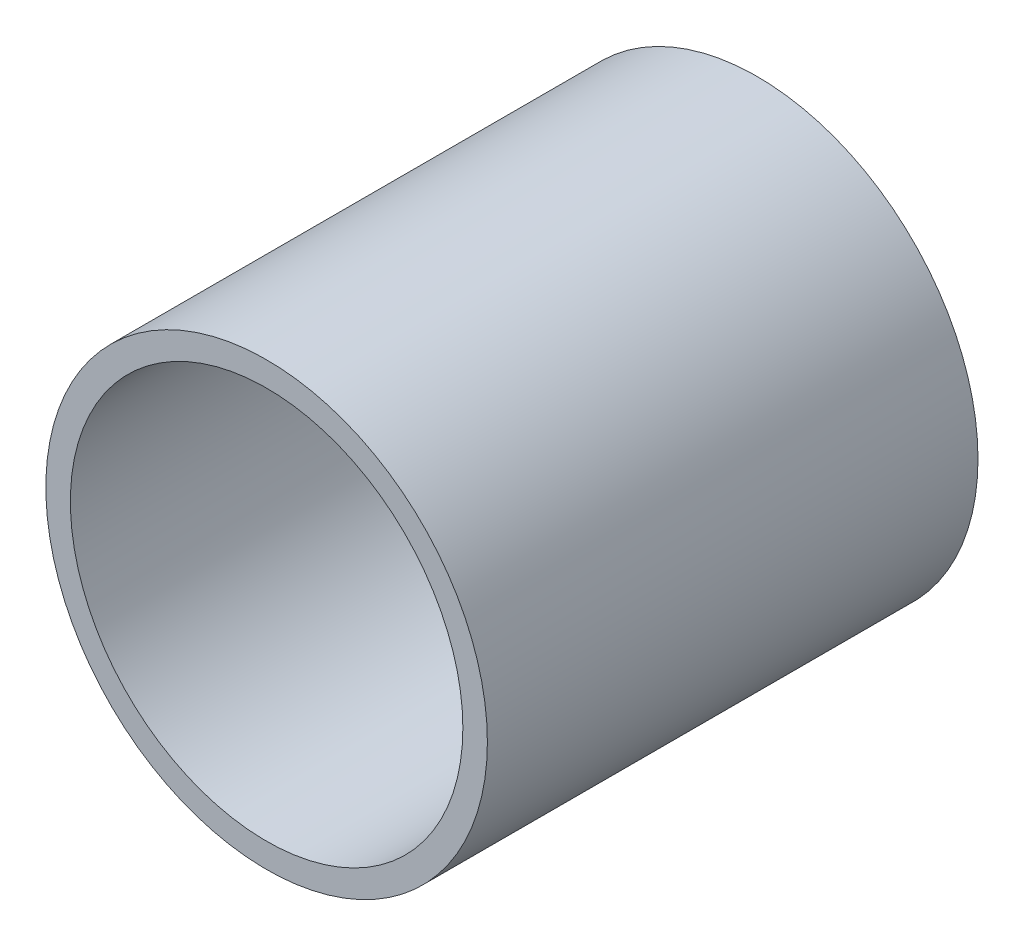
ISO-10303-21;
HEADER;
FILE_DESCRIPTION(('STEP AP214'),'2;1');
FILE_NAME('part.step','',(''),(''),'','','');
FILE_SCHEMA(('AUTOMOTIVE_DESIGN { 1 0 10303 214 1 1 1 1 }'));
ENDSEC;
DATA;
#1=APPLICATION_CONTEXT('core data for automotive mechanical design processes');
#2=APPLICATION_PROTOCOL_DEFINITION('international standard','automotive_design',2000,#1);
#3=PRODUCT_CONTEXT('',#1,'mechanical');
#4=PRODUCT('Part','Part','',(#3));
#5=PRODUCT_RELATED_PRODUCT_CATEGORY('part','',(#4));
#6=PRODUCT_DEFINITION_FORMATION('','',#4);
#7=PRODUCT_DEFINITION_CONTEXT('part definition',#1,'design');
#8=PRODUCT_DEFINITION('design','',#6,#7);
#9=PRODUCT_DEFINITION_SHAPE('','',#8);
#10=(LENGTH_UNIT() NAMED_UNIT(*) SI_UNIT(.MILLI.,.METRE.));
#11=(NAMED_UNIT(*) PLANE_ANGLE_UNIT() SI_UNIT($,.RADIAN.));
#12=(NAMED_UNIT(*) SI_UNIT($,.STERADIAN.) SOLID_ANGLE_UNIT());
#13=UNCERTAINTY_MEASURE_WITH_UNIT(LENGTH_MEASURE(1.E-05),#10,'distance_accuracy_value','');
#14=(GEOMETRIC_REPRESENTATION_CONTEXT(3) GLOBAL_UNCERTAINTY_ASSIGNED_CONTEXT((#13)) GLOBAL_UNIT_ASSIGNED_CONTEXT((#10,
#11,#12)) REPRESENTATION_CONTEXT('',''));
#15=CARTESIAN_POINT('',(0.,0.,0.));
#16=DIRECTION('',(0.,0.,1.));
#17=DIRECTION('',(1.,0.,0.));
#18=AXIS2_PLACEMENT_3D('',#15,#16,#17);
#19=CARTESIAN_POINT('',(0.,0.,20.));
#20=DIRECTION('',(0.,0.,1.));
#21=DIRECTION('',(1.,0.,0.));
#22=AXIS2_PLACEMENT_3D('',#19,#20,#21);
#23=PLANE('',#22);
#24=CARTESIAN_POINT('',(0.,0.,20.));
#25=DIRECTION('',(0.,0.,1.));
#26=DIRECTION('',(1.,0.,0.));
#27=AXIS2_PLACEMENT_3D('',#24,#25,#26);
#28=CIRCLE('',#27,9.);
#29=CARTESIAN_POINT('',(9.,0.,20.));
#30=VERTEX_POINT('',#29);
#31=EDGE_CURVE('E10',#30,#30,#28,.T.);
#32=ORIENTED_EDGE('',*,*,#31,.T.);
#33=EDGE_LOOP('',(#32));
#34=FACE_BOUND('',#33,.T.);
#35=CARTESIAN_POINT('',(0.,0.,20.));
#36=DIRECTION('',(0.,0.,1.));
#37=DIRECTION('',(1.,0.,0.));
#38=AXIS2_PLACEMENT_3D('',#35,#36,#37);
#39=CIRCLE('',#38,8.);
#40=CARTESIAN_POINT('',(8.,0.,20.));
#41=VERTEX_POINT('',#40);
#42=EDGE_CURVE('E42',#41,#41,#39,.T.);
#43=ORIENTED_EDGE('',*,*,#42,.F.);
#44=EDGE_LOOP('',(#43));
#45=FACE_BOUND('',#44,.T.);
#46=ADVANCED_FACE('F31',(#34,#45),#23,.T.);
#47=CARTESIAN_POINT('',(0.,0.,0.));
#48=DIRECTION('',(0.,0.,1.));
#49=DIRECTION('',(1.,0.,0.));
#50=AXIS2_PLACEMENT_3D('',#47,#48,#49);
#51=PLANE('',#50);
#52=CARTESIAN_POINT('',(0.,0.,0.));
#53=DIRECTION('',(0.,0.,1.));
#54=DIRECTION('',(1.,0.,0.));
#55=AXIS2_PLACEMENT_3D('',#52,#53,#54);
#56=CIRCLE('',#55,9.);
#57=CARTESIAN_POINT('',(9.,0.,0.));
#58=VERTEX_POINT('',#57);
#59=EDGE_CURVE('E35',#58,#58,#56,.T.);
#60=ORIENTED_EDGE('',*,*,#59,.F.);
#61=EDGE_LOOP('',(#60));
#62=FACE_BOUND('',#61,.T.);
#63=CARTESIAN_POINT('',(0.,0.,0.));
#64=DIRECTION('',(0.,0.,1.));
#65=DIRECTION('',(1.,0.,0.));
#66=AXIS2_PLACEMENT_3D('',#63,#64,#65);
#67=CIRCLE('',#66,8.);
#68=CARTESIAN_POINT('',(8.,0.,0.));
#69=VERTEX_POINT('',#68);
#70=EDGE_CURVE('E44',#69,#69,#67,.T.);
#71=ORIENTED_EDGE('',*,*,#70,.T.);
#72=EDGE_LOOP('',(#71));
#73=FACE_BOUND('',#72,.T.);
#74=ADVANCED_FACE('F54',(#62,#73),#51,.F.);
#75=CARTESIAN_POINT('',(0.,0.,20.));
#76=DIRECTION('',(0.,0.,-1.));
#77=DIRECTION('',(-1.,0.,0.));
#78=AXIS2_PLACEMENT_3D('',#75,#76,#77);
#79=CYLINDRICAL_SURFACE('',#78,9.);
#80=ORIENTED_EDGE('',*,*,#31,.F.);
#81=EDGE_LOOP('',(#80));
#82=FACE_BOUND('',#81,.T.);
#83=ORIENTED_EDGE('',*,*,#59,.T.);
#84=EDGE_LOOP('',(#83));
#85=FACE_BOUND('',#84,.T.);
#86=ADVANCED_FACE('F33',(#82,#85),#79,.T.);
#87=CARTESIAN_POINT('',(0.,0.,20.));
#88=DIRECTION('',(0.,0.,-1.));
#89=DIRECTION('',(-1.,0.,0.));
#90=AXIS2_PLACEMENT_3D('',#87,#88,#89);
#91=CYLINDRICAL_SURFACE('',#90,8.);
#92=ORIENTED_EDGE('',*,*,#42,.T.);
#93=EDGE_LOOP('',(#92));
#94=FACE_BOUND('',#93,.T.);
#95=ORIENTED_EDGE('',*,*,#70,.F.);
#96=EDGE_LOOP('',(#95));
#97=FACE_BOUND('',#96,.T.);
#98=ADVANCED_FACE('F50',(#94,#97),#91,.F.);
#99=CLOSED_SHELL('',(#46,#74,#86,#98));
#100=MANIFOLD_SOLID_BREP('B2',#99);
#101=ADVANCED_BREP_SHAPE_REPRESENTATION('',(#18,#100),#14);
#102=SHAPE_DEFINITION_REPRESENTATION(#9,#101);
ENDSEC;
END-ISO-10303-21;
